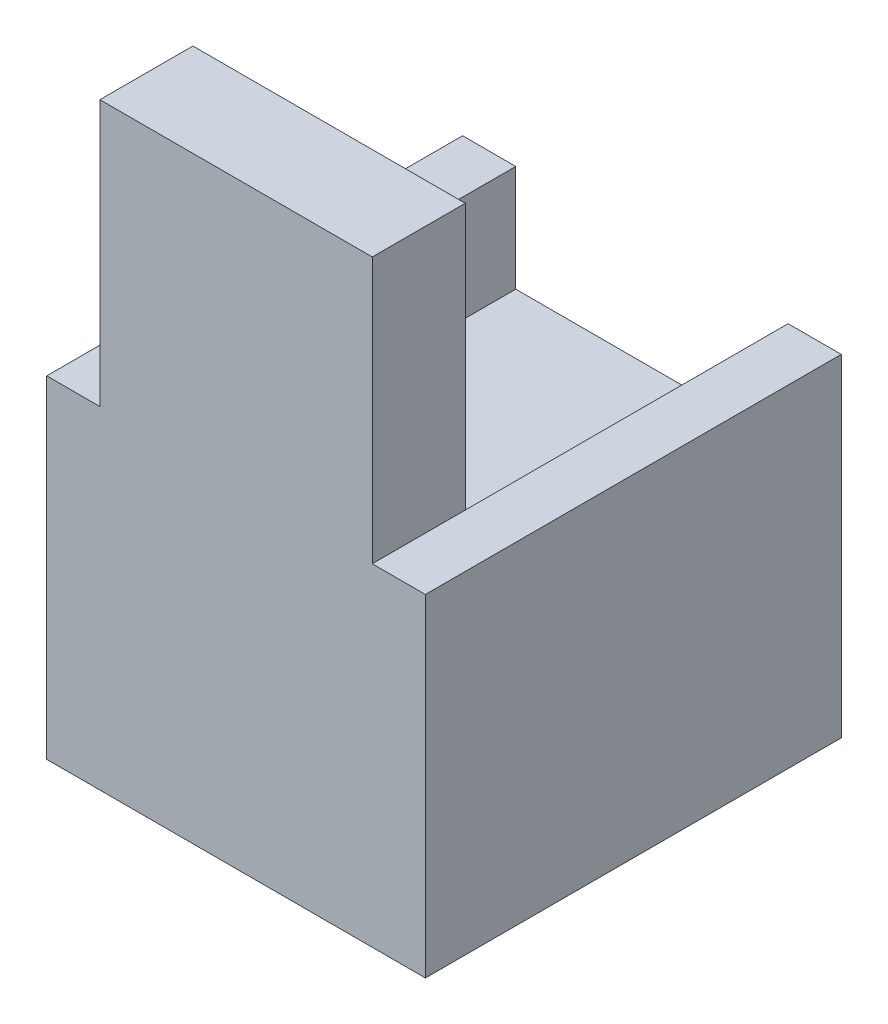
ISO-10303-21;
HEADER;
FILE_DESCRIPTION(('STEP AP214'),'2;1');
FILE_NAME('part.step','',(''),(''),'','','');
FILE_SCHEMA(('AUTOMOTIVE_DESIGN { 1 0 10303 214 1 1 1 1 }'));
ENDSEC;
DATA;
#1=APPLICATION_CONTEXT('core data for automotive mechanical design processes');
#2=APPLICATION_PROTOCOL_DEFINITION('international standard','automotive_design',2000,#1);
#3=PRODUCT_CONTEXT('',#1,'mechanical');
#4=PRODUCT('Part','Part','',(#3));
#5=PRODUCT_RELATED_PRODUCT_CATEGORY('part','',(#4));
#6=PRODUCT_DEFINITION_FORMATION('','',#4);
#7=PRODUCT_DEFINITION_CONTEXT('part definition',#1,'design');
#8=PRODUCT_DEFINITION('design','',#6,#7);
#9=PRODUCT_DEFINITION_SHAPE('','',#8);
#10=(LENGTH_UNIT() NAMED_UNIT(*) SI_UNIT(.MILLI.,.METRE.));
#11=(NAMED_UNIT(*) PLANE_ANGLE_UNIT() SI_UNIT($,.RADIAN.));
#12=(NAMED_UNIT(*) SI_UNIT($,.STERADIAN.) SOLID_ANGLE_UNIT());
#13=UNCERTAINTY_MEASURE_WITH_UNIT(LENGTH_MEASURE(1.E-05),#10,'distance_accuracy_value','');
#14=(GEOMETRIC_REPRESENTATION_CONTEXT(3) GLOBAL_UNCERTAINTY_ASSIGNED_CONTEXT((#13)) GLOBAL_UNIT_ASSIGNED_CONTEXT((#10,
#11,#12)) REPRESENTATION_CONTEXT('',''));
#15=CARTESIAN_POINT('',(0.,0.,0.));
#16=DIRECTION('',(0.,0.,1.));
#17=DIRECTION('',(1.,0.,0.));
#18=AXIS2_PLACEMENT_3D('',#15,#16,#17);
#19=CARTESIAN_POINT('',(0.,431.8,0.));
#20=DIRECTION('',(0.,1.,0.));
#21=DIRECTION('',(0.,0.,1.));
#22=AXIS2_PLACEMENT_3D('',#19,#20,#21);
#23=PLANE('',#22);
#24=DIRECTION('',(0.,0.,-1.));
#25=VECTOR('',#24,1.);
#26=CARTESIAN_POINT('',(-294.203948497854,431.8,0.));
#27=LINE('',#26,#25);
#28=CARTESIAN_POINT('',(-294.203948497854,431.8,617.22));
#29=VERTEX_POINT('',#28);
#30=CARTESIAN_POINT('',(-294.203948497854,431.8,0.));
#31=VERTEX_POINT('',#30);
#32=EDGE_CURVE('E169',#29,#31,#27,.T.);
#33=ORIENTED_EDGE('',*,*,#32,.F.);
#34=DIRECTION('',(-1.,0.,0.));
#35=VECTOR('',#34,1.);
#36=CARTESIAN_POINT('',(-294.203948497854,431.8,617.22));
#37=LINE('',#36,#35);
#38=CARTESIAN_POINT('',(226.496051502146,431.8,617.22));
#39=VERTEX_POINT('',#38);
#40=EDGE_CURVE('E143',#39,#29,#37,.T.);
#41=ORIENTED_EDGE('',*,*,#40,.F.);
#42=DIRECTION('',(0.,0.,1.));
#43=VECTOR('',#42,1.);
#44=CARTESIAN_POINT('',(226.496051502146,431.8,0.));
#45=LINE('',#44,#43);
#46=CARTESIAN_POINT('',(226.496051502146,431.8,0.));
#47=VERTEX_POINT('',#46);
#48=EDGE_CURVE('E51',#47,#39,#45,.T.);
#49=ORIENTED_EDGE('',*,*,#48,.F.);
#50=DIRECTION('',(-1.,0.,0.));
#51=VECTOR('',#50,1.);
#52=CARTESIAN_POINT('',(-395.803948497854,431.8,0.));
#53=LINE('',#52,#51);
#54=EDGE_CURVE('E185',#47,#31,#53,.T.);
#55=ORIENTED_EDGE('',*,*,#54,.T.);
#56=EDGE_LOOP('',(#33,#41,#49,#55));
#57=FACE_BOUND('',#56,.T.);
#58=ADVANCED_FACE('F36',(#57),#23,.T.);
#59=CARTESIAN_POINT('',(-294.203948497854,635.,0.));
#60=DIRECTION('',(-1.,0.,0.));
#61=DIRECTION('',(0.,0.,1.));
#62=AXIS2_PLACEMENT_3D('',#59,#60,#61);
#63=PLANE('',#62);
#64=DIRECTION('',(0.,-1.,0.));
#65=VECTOR('',#64,1.);
#66=CARTESIAN_POINT('',(-294.203948497854,1143.,617.22));
#67=LINE('',#66,#65);
#68=CARTESIAN_POINT('',(-294.203948497854,635.,617.22));
#69=VERTEX_POINT('',#68);
#70=EDGE_CURVE('E236',#69,#29,#67,.T.);
#71=ORIENTED_EDGE('',*,*,#70,.T.);
#72=ORIENTED_EDGE('',*,*,#32,.T.);
#73=DIRECTION('',(0.,-1.,0.));
#74=VECTOR('',#73,1.);
#75=CARTESIAN_POINT('',(-294.203948497854,635.,0.));
#76=LINE('',#75,#74);
#77=CARTESIAN_POINT('',(-294.203948497854,635.,0.));
#78=VERTEX_POINT('',#77);
#79=EDGE_CURVE('E180',#78,#31,#76,.T.);
#80=ORIENTED_EDGE('',*,*,#79,.F.);
#81=DIRECTION('',(0.,0.,-1.));
#82=VECTOR('',#81,1.);
#83=CARTESIAN_POINT('',(-294.203948497854,635.,0.));
#84=LINE('',#83,#82);
#85=EDGE_CURVE('E175',#69,#78,#84,.T.);
#86=ORIENTED_EDGE('',*,*,#85,.F.);
#87=EDGE_LOOP('',(#71,#72,#80,#86));
#88=FACE_BOUND('',#87,.T.);
#89=ADVANCED_FACE('F215',(#88),#63,.F.);
#90=CARTESIAN_POINT('',(226.496051502146,635.,0.));
#91=DIRECTION('',(1.,0.,0.));
#92=DIRECTION('',(0.,0.,-1.));
#93=AXIS2_PLACEMENT_3D('',#90,#91,#92);
#94=PLANE('',#93);
#95=DIRECTION('',(0.,-1.,0.));
#96=VECTOR('',#95,1.);
#97=CARTESIAN_POINT('',(226.496051502146,1143.,617.22));
#98=LINE('',#97,#96);
#99=CARTESIAN_POINT('',(226.496051502146,635.,617.22));
#100=VERTEX_POINT('',#99);
#101=EDGE_CURVE('E223',#100,#39,#98,.T.);
#102=ORIENTED_EDGE('',*,*,#101,.F.);
#103=DIRECTION('',(0.,0.,1.));
#104=VECTOR('',#103,1.);
#105=CARTESIAN_POINT('',(226.496051502146,635.,0.));
#106=LINE('',#105,#104);
#107=CARTESIAN_POINT('',(226.496051502146,635.,0.));
#108=VERTEX_POINT('',#107);
#109=EDGE_CURVE('E160',#108,#100,#106,.T.);
#110=ORIENTED_EDGE('',*,*,#109,.F.);
#111=DIRECTION('',(0.,-1.,0.));
#112=VECTOR('',#111,1.);
#113=CARTESIAN_POINT('',(226.496051502146,635.,0.));
#114=LINE('',#113,#112);
#115=EDGE_CURVE('E165',#108,#47,#114,.T.);
#116=ORIENTED_EDGE('',*,*,#115,.T.);
#117=ORIENTED_EDGE('',*,*,#48,.T.);
#118=EDGE_LOOP('',(#102,#110,#116,#117));
#119=FACE_BOUND('',#118,.T.);
#120=ADVANCED_FACE('F222',(#119),#94,.F.);
#121=CARTESIAN_POINT('',(-395.803948497854,431.8,0.));
#122=DIRECTION('',(1.,0.,0.));
#123=DIRECTION('',(0.,0.,-1.));
#124=AXIS2_PLACEMENT_3D('',#121,#122,#123);
#125=PLANE('',#124);
#126=DIRECTION('',(0.,0.,1.));
#127=VECTOR('',#126,1.);
#128=CARTESIAN_POINT('',(-395.803948497854,0.,0.));
#129=LINE('',#128,#127);
#130=CARTESIAN_POINT('',(-395.803948497854,0.,0.));
#131=VERTEX_POINT('',#130);
#132=CARTESIAN_POINT('',(-395.803948497854,0.,795.02));
#133=VERTEX_POINT('',#132);
#134=EDGE_CURVE('E184',#131,#133,#129,.T.);
#135=ORIENTED_EDGE('',*,*,#134,.T.);
#136=DIRECTION('',(0.,-1.,0.));
#137=VECTOR('',#136,1.);
#138=CARTESIAN_POINT('',(-395.803948497854,431.8,795.02));
#139=LINE('',#138,#137);
#140=CARTESIAN_POINT('',(-395.803948497854,635.,795.02));
#141=VERTEX_POINT('',#140);
#142=EDGE_CURVE('E11',#141,#133,#139,.T.);
#143=ORIENTED_EDGE('',*,*,#142,.F.);
#144=DIRECTION('',(0.,0.,1.));
#145=VECTOR('',#144,1.);
#146=CARTESIAN_POINT('',(-395.803948497854,635.,0.));
#147=LINE('',#146,#145);
#148=CARTESIAN_POINT('',(-395.803948497854,635.,0.));
#149=VERTEX_POINT('',#148);
#150=EDGE_CURVE('E170',#149,#141,#147,.T.);
#151=ORIENTED_EDGE('',*,*,#150,.F.);
#152=DIRECTION('',(0.,-1.,0.));
#153=VECTOR('',#152,1.);
#154=CARTESIAN_POINT('',(-395.803948497854,431.8,0.));
#155=LINE('',#154,#153);
#156=EDGE_CURVE('E187',#149,#131,#155,.T.);
#157=ORIENTED_EDGE('',*,*,#156,.T.);
#158=EDGE_LOOP('',(#135,#143,#151,#157));
#159=FACE_BOUND('',#158,.T.);
#160=ADVANCED_FACE('F38',(#159),#125,.F.);
#161=CARTESIAN_POINT('',(-395.803948497854,431.8,795.02));
#162=DIRECTION('',(0.,0.,-1.));
#163=DIRECTION('',(-1.,0.,0.));
#164=AXIS2_PLACEMENT_3D('',#161,#162,#163);
#165=PLANE('',#164);
#166=DIRECTION('',(1.,0.,0.));
#167=VECTOR('',#166,1.);
#168=CARTESIAN_POINT('',(-395.803948497854,0.,795.02));
#169=LINE('',#168,#167);
#170=CARTESIAN_POINT('',(328.096051502146,0.,795.02));
#171=VERTEX_POINT('',#170);
#172=EDGE_CURVE('E190',#133,#171,#169,.T.);
#173=ORIENTED_EDGE('',*,*,#172,.T.);
#174=DIRECTION('',(0.,-1.,0.));
#175=VECTOR('',#174,1.);
#176=CARTESIAN_POINT('',(328.096051502146,431.8,795.02));
#177=LINE('',#176,#175);
#178=CARTESIAN_POINT('',(328.096051502146,635.,795.02));
#179=VERTEX_POINT('',#178);
#180=EDGE_CURVE('E44',#179,#171,#177,.T.);
#181=ORIENTED_EDGE('',*,*,#180,.F.);
#182=DIRECTION('',(1.,0.,0.));
#183=VECTOR('',#182,1.);
#184=CARTESIAN_POINT('',(328.096051502146,635.,795.02));
#185=LINE('',#184,#183);
#186=CARTESIAN_POINT('',(226.496051502146,635.,795.02));
#187=VERTEX_POINT('',#186);
#188=EDGE_CURVE('E163',#187,#179,#185,.T.);
#189=ORIENTED_EDGE('',*,*,#188,.F.);
#190=DIRECTION('',(0.,-1.,0.));
#191=VECTOR('',#190,1.);
#192=CARTESIAN_POINT('',(226.496051502146,1143.,795.02));
#193=LINE('',#192,#191);
#194=CARTESIAN_POINT('',(226.496051502146,1143.,795.02));
#195=VERTEX_POINT('',#194);
#196=EDGE_CURVE('E130',#195,#187,#193,.T.);
#197=ORIENTED_EDGE('',*,*,#196,.F.);
#198=DIRECTION('',(1.,0.,0.));
#199=VECTOR('',#198,1.);
#200=CARTESIAN_POINT('',(-294.203948497854,1143.,795.02));
#201=LINE('',#200,#199);
#202=CARTESIAN_POINT('',(-294.203948497854,1143.,795.02));
#203=VERTEX_POINT('',#202);
#204=EDGE_CURVE('E122',#203,#195,#201,.T.);
#205=ORIENTED_EDGE('',*,*,#204,.F.);
#206=DIRECTION('',(0.,-1.,0.));
#207=VECTOR('',#206,1.);
#208=CARTESIAN_POINT('',(-294.203948497854,1143.,795.02));
#209=LINE('',#208,#207);
#210=CARTESIAN_POINT('',(-294.203948497854,635.,795.02));
#211=VERTEX_POINT('',#210);
#212=EDGE_CURVE('E127',#203,#211,#209,.T.);
#213=ORIENTED_EDGE('',*,*,#212,.T.);
#214=DIRECTION('',(1.,0.,0.));
#215=VECTOR('',#214,1.);
#216=CARTESIAN_POINT('',(-395.803948497854,635.,795.02));
#217=LINE('',#216,#215);
#218=EDGE_CURVE('E173',#141,#211,#217,.T.);
#219=ORIENTED_EDGE('',*,*,#218,.F.);
#220=ORIENTED_EDGE('',*,*,#142,.T.);
#221=EDGE_LOOP('',(#173,#181,#189,#197,#205,#213,#219,#220));
#222=FACE_BOUND('',#221,.T.);
#223=ADVANCED_FACE('F124',(#222),#165,.F.);
#224=CARTESIAN_POINT('',(328.096051502146,431.8,0.));
#225=DIRECTION('',(-1.,0.,0.));
#226=DIRECTION('',(0.,0.,1.));
#227=AXIS2_PLACEMENT_3D('',#224,#225,#226);
#228=PLANE('',#227);
#229=DIRECTION('',(0.,0.,-1.));
#230=VECTOR('',#229,1.);
#231=CARTESIAN_POINT('',(328.096051502146,0.,0.));
#232=LINE('',#231,#230);
#233=CARTESIAN_POINT('',(328.096051502146,0.,0.));
#234=VERTEX_POINT('',#233);
#235=EDGE_CURVE('E192',#171,#234,#232,.T.);
#236=ORIENTED_EDGE('',*,*,#235,.T.);
#237=DIRECTION('',(0.,-1.,0.));
#238=VECTOR('',#237,1.);
#239=CARTESIAN_POINT('',(328.096051502146,431.8,0.));
#240=LINE('',#239,#238);
#241=CARTESIAN_POINT('',(328.096051502146,635.,0.));
#242=VERTEX_POINT('',#241);
#243=EDGE_CURVE('E196',#242,#234,#240,.T.);
#244=ORIENTED_EDGE('',*,*,#243,.F.);
#245=DIRECTION('',(0.,0.,-1.));
#246=VECTOR('',#245,1.);
#247=CARTESIAN_POINT('',(328.096051502146,635.,0.));
#248=LINE('',#247,#246);
#249=EDGE_CURVE('E149',#179,#242,#248,.T.);
#250=ORIENTED_EDGE('',*,*,#249,.F.);
#251=ORIENTED_EDGE('',*,*,#180,.T.);
#252=EDGE_LOOP('',(#236,#244,#250,#251));
#253=FACE_BOUND('',#252,.T.);
#254=ADVANCED_FACE('F201',(#253),#228,.F.);
#255=CARTESIAN_POINT('',(-395.803948497854,431.8,0.));
#256=DIRECTION('',(0.,0.,1.));
#257=DIRECTION('',(1.,0.,0.));
#258=AXIS2_PLACEMENT_3D('',#255,#256,#257);
#259=PLANE('',#258);
#260=DIRECTION('',(-1.,0.,0.));
#261=VECTOR('',#260,1.);
#262=CARTESIAN_POINT('',(-395.803948497854,0.,0.));
#263=LINE('',#262,#261);
#264=EDGE_CURVE('E59',#234,#131,#263,.T.);
#265=ORIENTED_EDGE('',*,*,#264,.T.);
#266=ORIENTED_EDGE('',*,*,#156,.F.);
#267=DIRECTION('',(-1.,0.,0.));
#268=VECTOR('',#267,1.);
#269=CARTESIAN_POINT('',(-395.803948497854,635.,0.));
#270=LINE('',#269,#268);
#271=EDGE_CURVE('E177',#78,#149,#270,.T.);
#272=ORIENTED_EDGE('',*,*,#271,.F.);
#273=ORIENTED_EDGE('',*,*,#79,.T.);
#274=ORIENTED_EDGE('',*,*,#54,.F.);
#275=ORIENTED_EDGE('',*,*,#115,.F.);
#276=DIRECTION('',(-1.,0.,0.));
#277=VECTOR('',#276,1.);
#278=CARTESIAN_POINT('',(328.096051502146,635.,0.));
#279=LINE('',#278,#277);
#280=EDGE_CURVE('E157',#242,#108,#279,.T.);
#281=ORIENTED_EDGE('',*,*,#280,.F.);
#282=ORIENTED_EDGE('',*,*,#243,.T.);
#283=EDGE_LOOP('',(#265,#266,#272,#273,#274,#275,#281,#282));
#284=FACE_BOUND('',#283,.T.);
#285=ADVANCED_FACE('F208',(#284),#259,.F.);
#286=CARTESIAN_POINT('',(0.,0.,0.));
#287=DIRECTION('',(0.,1.,0.));
#288=DIRECTION('',(0.,0.,1.));
#289=AXIS2_PLACEMENT_3D('',#286,#287,#288);
#290=PLANE('',#289);
#291=ORIENTED_EDGE('',*,*,#134,.F.);
#292=ORIENTED_EDGE('',*,*,#264,.F.);
#293=ORIENTED_EDGE('',*,*,#235,.F.);
#294=ORIENTED_EDGE('',*,*,#172,.F.);
#295=EDGE_LOOP('',(#291,#292,#293,#294));
#296=FACE_BOUND('',#295,.T.);
#297=ADVANCED_FACE('F204',(#296),#290,.F.);
#298=CARTESIAN_POINT('',(0.,635.,0.));
#299=DIRECTION('',(0.,1.,0.));
#300=DIRECTION('',(0.,0.,1.));
#301=AXIS2_PLACEMENT_3D('',#298,#299,#300);
#302=PLANE('',#301);
#303=ORIENTED_EDGE('',*,*,#150,.T.);
#304=ORIENTED_EDGE('',*,*,#218,.T.);
#305=EDGE_CURVE('E147',#211,#69,#84,.T.);
#306=ORIENTED_EDGE('',*,*,#305,.T.);
#307=ORIENTED_EDGE('',*,*,#85,.T.);
#308=ORIENTED_EDGE('',*,*,#271,.T.);
#309=EDGE_LOOP('',(#303,#304,#306,#307,#308));
#310=FACE_BOUND('',#309,.T.);
#311=ADVANCED_FACE('F210',(#310),#302,.T.);
#312=CARTESIAN_POINT('',(0.,635.,0.));
#313=DIRECTION('',(0.,-1.,0.));
#314=DIRECTION('',(0.,0.,-1.));
#315=AXIS2_PLACEMENT_3D('',#312,#313,#314);
#316=PLANE('',#315);
#317=ORIENTED_EDGE('',*,*,#249,.T.);
#318=ORIENTED_EDGE('',*,*,#280,.T.);
#319=ORIENTED_EDGE('',*,*,#109,.T.);
#320=EDGE_CURVE('E159',#100,#187,#106,.T.);
#321=ORIENTED_EDGE('',*,*,#320,.T.);
#322=ORIENTED_EDGE('',*,*,#188,.T.);
#323=EDGE_LOOP('',(#317,#318,#319,#321,#322));
#324=FACE_BOUND('',#323,.T.);
#325=ADVANCED_FACE('F226',(#324),#316,.F.);
#326=CARTESIAN_POINT('',(226.496051502146,1143.,617.22));
#327=DIRECTION('',(-1.,0.,0.));
#328=DIRECTION('',(0.,0.,1.));
#329=AXIS2_PLACEMENT_3D('',#326,#327,#328);
#330=PLANE('',#329);
#331=ORIENTED_EDGE('',*,*,#196,.T.);
#332=ORIENTED_EDGE('',*,*,#320,.F.);
#333=CARTESIAN_POINT('',(226.496051502146,1143.,617.22));
#334=VERTEX_POINT('',#333);
#335=EDGE_CURVE('E151',#334,#100,#98,.T.);
#336=ORIENTED_EDGE('',*,*,#335,.F.);
#337=DIRECTION('',(0.,0.,-1.));
#338=VECTOR('',#337,1.);
#339=CARTESIAN_POINT('',(226.496051502146,1143.,617.22));
#340=LINE('',#339,#338);
#341=EDGE_CURVE('E133',#195,#334,#340,.T.);
#342=ORIENTED_EDGE('',*,*,#341,.F.);
#343=EDGE_LOOP('',(#331,#332,#336,#342));
#344=FACE_BOUND('',#343,.T.);
#345=ADVANCED_FACE('F230',(#344),#330,.F.);
#346=CARTESIAN_POINT('',(-294.203948497854,1143.,617.22));
#347=DIRECTION('',(1.,0.,0.));
#348=DIRECTION('',(0.,0.,-1.));
#349=AXIS2_PLACEMENT_3D('',#346,#347,#348);
#350=PLANE('',#349);
#351=ORIENTED_EDGE('',*,*,#305,.F.);
#352=ORIENTED_EDGE('',*,*,#212,.F.);
#353=DIRECTION('',(0.,0.,1.));
#354=VECTOR('',#353,1.);
#355=CARTESIAN_POINT('',(-294.203948497854,1143.,617.22));
#356=LINE('',#355,#354);
#357=CARTESIAN_POINT('',(-294.203948497854,1143.,617.22));
#358=VERTEX_POINT('',#357);
#359=EDGE_CURVE('E134',#358,#203,#356,.T.);
#360=ORIENTED_EDGE('',*,*,#359,.F.);
#361=EDGE_CURVE('E233',#358,#69,#67,.T.);
#362=ORIENTED_EDGE('',*,*,#361,.T.);
#363=EDGE_LOOP('',(#351,#352,#360,#362));
#364=FACE_BOUND('',#363,.T.);
#365=ADVANCED_FACE('F145',(#364),#350,.F.);
#366=CARTESIAN_POINT('',(-294.203948497854,1143.,617.22));
#367=DIRECTION('',(0.,0.,1.));
#368=DIRECTION('',(1.,0.,0.));
#369=AXIS2_PLACEMENT_3D('',#366,#367,#368);
#370=PLANE('',#369);
#371=ORIENTED_EDGE('',*,*,#40,.T.);
#372=ORIENTED_EDGE('',*,*,#70,.F.);
#373=ORIENTED_EDGE('',*,*,#361,.F.);
#374=DIRECTION('',(-1.,0.,0.));
#375=VECTOR('',#374,1.);
#376=CARTESIAN_POINT('',(-294.203948497854,1143.,617.22));
#377=LINE('',#376,#375);
#378=EDGE_CURVE('E139',#334,#358,#377,.T.);
#379=ORIENTED_EDGE('',*,*,#378,.F.);
#380=ORIENTED_EDGE('',*,*,#335,.T.);
#381=ORIENTED_EDGE('',*,*,#101,.T.);
#382=EDGE_LOOP('',(#371,#372,#373,#379,#380,#381));
#383=FACE_BOUND('',#382,.T.);
#384=ADVANCED_FACE('F232',(#383),#370,.F.);
#385=CARTESIAN_POINT('',(0.,1143.,0.));
#386=DIRECTION('',(0.,1.,0.));
#387=DIRECTION('',(0.,0.,1.));
#388=AXIS2_PLACEMENT_3D('',#385,#386,#387);
#389=PLANE('',#388);
#390=ORIENTED_EDGE('',*,*,#359,.T.);
#391=ORIENTED_EDGE('',*,*,#204,.T.);
#392=ORIENTED_EDGE('',*,*,#341,.T.);
#393=ORIENTED_EDGE('',*,*,#378,.T.);
#394=EDGE_LOOP('',(#390,#391,#392,#393));
#395=FACE_BOUND('',#394,.T.);
#396=ADVANCED_FACE('F137',(#395),#389,.T.);
#397=CLOSED_SHELL('',(#58,#89,#120,#160,#223,#254,#285,#297,#311,#325,#345,#365,#384,#396));
#398=MANIFOLD_SOLID_BREP('B2',#397);
#399=ADVANCED_BREP_SHAPE_REPRESENTATION('',(#18,#398),#14);
#400=SHAPE_DEFINITION_REPRESENTATION(#9,#399);
ENDSEC;
END-ISO-10303-21;
